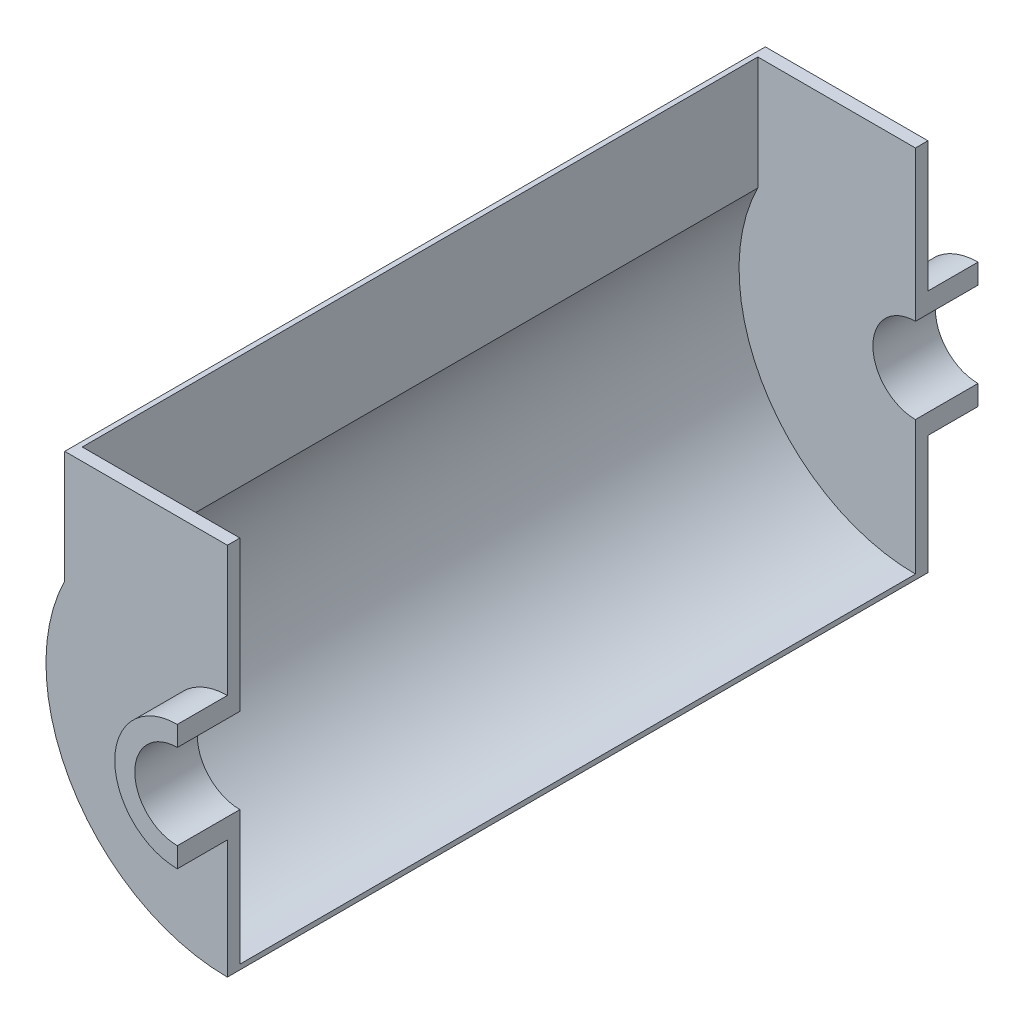
ISO-10303-21;
HEADER;
FILE_DESCRIPTION(('STEP AP214'),'2;1');
FILE_NAME('part.step','',(''),(''),'','','');
FILE_SCHEMA(('AUTOMOTIVE_DESIGN { 1 0 10303 214 1 1 1 1 }'));
ENDSEC;
DATA;
#1=APPLICATION_CONTEXT('core data for automotive mechanical design processes');
#2=APPLICATION_PROTOCOL_DEFINITION('international standard','automotive_design',2000,#1);
#3=PRODUCT_CONTEXT('',#1,'mechanical');
#4=PRODUCT('Part','Part','',(#3));
#5=PRODUCT_RELATED_PRODUCT_CATEGORY('part','',(#4));
#6=PRODUCT_DEFINITION_FORMATION('','',#4);
#7=PRODUCT_DEFINITION_CONTEXT('part definition',#1,'design');
#8=PRODUCT_DEFINITION('design','',#6,#7);
#9=PRODUCT_DEFINITION_SHAPE('','',#8);
#10=(LENGTH_UNIT() NAMED_UNIT(*) SI_UNIT(.MILLI.,.METRE.));
#11=(NAMED_UNIT(*) PLANE_ANGLE_UNIT() SI_UNIT($,.RADIAN.));
#12=(NAMED_UNIT(*) SI_UNIT($,.STERADIAN.) SOLID_ANGLE_UNIT());
#13=UNCERTAINTY_MEASURE_WITH_UNIT(LENGTH_MEASURE(1.E-05),#10,'distance_accuracy_value','');
#14=(GEOMETRIC_REPRESENTATION_CONTEXT(3) GLOBAL_UNCERTAINTY_ASSIGNED_CONTEXT((#13)) GLOBAL_UNIT_ASSIGNED_CONTEXT((#10,
#11,#12)) REPRESENTATION_CONTEXT('',''));
#15=CARTESIAN_POINT('',(0.,0.,0.));
#16=DIRECTION('',(0.,0.,1.));
#17=DIRECTION('',(1.,0.,0.));
#18=AXIS2_PLACEMENT_3D('',#15,#16,#17);
#19=CARTESIAN_POINT('',(0.,0.,-5.));
#20=DIRECTION('',(0.,0.,1.));
#21=DIRECTION('',(1.,0.,0.));
#22=AXIS2_PLACEMENT_3D('',#19,#20,#21);
#23=CYLINDRICAL_SURFACE('',#22,17.);
#24=DIRECTION('',(0.,0.,1.));
#25=VECTOR('',#24,1.);
#26=CARTESIAN_POINT('',(0.,17.,-5.));
#27=LINE('',#26,#25);
#28=CARTESIAN_POINT('',(0.,17.,-5.));
#29=VERTEX_POINT('',#28);
#30=CARTESIAN_POINT('',(0.,17.,20.));
#31=VERTEX_POINT('',#30);
#32=EDGE_CURVE('E40',#29,#31,#27,.T.);
#33=ORIENTED_EDGE('',*,*,#32,.T.);
#34=CARTESIAN_POINT('',(0.,0.,20.));
#35=DIRECTION('',(0.,0.,-1.));
#36=DIRECTION('',(1.,0.,0.));
#37=AXIS2_PLACEMENT_3D('',#34,#35,#36);
#38=CIRCLE('',#37,17.);
#39=CARTESIAN_POINT('',(0.,-17.,20.));
#40=VERTEX_POINT('',#39);
#41=EDGE_CURVE('E230',#40,#31,#38,.T.);
#42=ORIENTED_EDGE('',*,*,#41,.F.);
#43=DIRECTION('',(0.,0.,1.));
#44=VECTOR('',#43,1.);
#45=CARTESIAN_POINT('',(0.,-17.,-5.));
#46=LINE('',#45,#44);
#47=CARTESIAN_POINT('',(0.,-17.,-5.));
#48=VERTEX_POINT('',#47);
#49=EDGE_CURVE('E11',#48,#40,#46,.T.);
#50=ORIENTED_EDGE('',*,*,#49,.F.);
#51=CARTESIAN_POINT('',(0.,0.,-5.));
#52=DIRECTION('',(0.,0.,-1.));
#53=DIRECTION('',(1.,0.,0.));
#54=AXIS2_PLACEMENT_3D('',#51,#52,#53);
#55=CIRCLE('',#54,17.);
#56=EDGE_CURVE('E247',#48,#29,#55,.T.);
#57=ORIENTED_EDGE('',*,*,#56,.T.);
#58=EDGE_LOOP('',(#33,#42,#50,#57));
#59=FACE_BOUND('',#58,.T.);
#60=ADVANCED_FACE('F37',(#59),#23,.F.);
#61=CARTESIAN_POINT('',(0.,-17.,-5.));
#62=DIRECTION('',(1.,0.,0.));
#63=DIRECTION('',(0.,0.,-1.));
#64=AXIS2_PLACEMENT_3D('',#61,#62,#63);
#65=PLANE('',#64);
#66=ORIENTED_EDGE('',*,*,#49,.T.);
#67=DIRECTION('',(0.,1.,0.));
#68=VECTOR('',#67,1.);
#69=CARTESIAN_POINT('',(0.,-17.,20.));
#70=LINE('',#69,#68);
#71=CARTESIAN_POINT('',(0.,-25.,20.));
#72=VERTEX_POINT('',#71);
#73=EDGE_CURVE('E244',#72,#40,#70,.T.);
#74=ORIENTED_EDGE('',*,*,#73,.F.);
#75=DIRECTION('',(0.,0.,1.));
#76=VECTOR('',#75,1.);
#77=CARTESIAN_POINT('',(0.,-25.,-5.));
#78=LINE('',#77,#76);
#79=CARTESIAN_POINT('',(0.,-25.,0.));
#80=VERTEX_POINT('',#79);
#81=EDGE_CURVE('E45',#80,#72,#78,.T.);
#82=ORIENTED_EDGE('',*,*,#81,.F.);
#83=DIRECTION('',(0.,1.,0.));
#84=VECTOR('',#83,1.);
#85=CARTESIAN_POINT('',(0.,-25.,0.));
#86=LINE('',#85,#84);
#87=CARTESIAN_POINT('',(0.,-72.5,0.));
#88=VERTEX_POINT('',#87);
#89=EDGE_CURVE('E212',#88,#80,#86,.T.);
#90=ORIENTED_EDGE('',*,*,#89,.F.);
#91=DIRECTION('',(0.,0.,1.));
#92=VECTOR('',#91,1.);
#93=CARTESIAN_POINT('',(0.,-72.5,-5.));
#94=LINE('',#93,#92);
#95=CARTESIAN_POINT('',(0.,-72.5,-280.));
#96=VERTEX_POINT('',#95);
#97=EDGE_CURVE('E228',#96,#88,#94,.T.);
#98=ORIENTED_EDGE('',*,*,#97,.F.);
#99=DIRECTION('',(0.,1.,0.));
#100=VECTOR('',#99,1.);
#101=CARTESIAN_POINT('',(0.,-25.,-280.));
#102=LINE('',#101,#100);
#103=CARTESIAN_POINT('',(0.,-25.,-280.));
#104=VERTEX_POINT('',#103);
#105=EDGE_CURVE('E161',#96,#104,#102,.T.);
#106=ORIENTED_EDGE('',*,*,#105,.T.);
#107=DIRECTION('',(0.,0.,-1.));
#108=VECTOR('',#107,1.);
#109=CARTESIAN_POINT('',(0.,-25.,-275.));
#110=LINE('',#109,#108);
#111=CARTESIAN_POINT('',(0.,-25.,-300.));
#112=VERTEX_POINT('',#111);
#113=EDGE_CURVE('E188',#104,#112,#110,.T.);
#114=ORIENTED_EDGE('',*,*,#113,.T.);
#115=DIRECTION('',(0.,1.,0.));
#116=VECTOR('',#115,1.);
#117=CARTESIAN_POINT('',(0.,-17.,-300.));
#118=LINE('',#117,#116);
#119=CARTESIAN_POINT('',(0.,-17.,-300.));
#120=VERTEX_POINT('',#119);
#121=EDGE_CURVE('E180',#112,#120,#118,.T.);
#122=ORIENTED_EDGE('',*,*,#121,.T.);
#123=DIRECTION('',(0.,0.,-1.));
#124=VECTOR('',#123,1.);
#125=CARTESIAN_POINT('',(0.,-17.,-275.));
#126=LINE('',#125,#124);
#127=CARTESIAN_POINT('',(0.,-17.,-275.));
#128=VERTEX_POINT('',#127);
#129=EDGE_CURVE('E184',#128,#120,#126,.T.);
#130=ORIENTED_EDGE('',*,*,#129,.F.);
#131=DIRECTION('',(0.,1.,0.));
#132=VECTOR('',#131,1.);
#133=CARTESIAN_POINT('',(0.,-17.,-275.));
#134=LINE('',#133,#132);
#135=CARTESIAN_POINT('',(0.,-70.5,-275.));
#136=VERTEX_POINT('',#135);
#137=EDGE_CURVE('E176',#136,#128,#134,.T.);
#138=ORIENTED_EDGE('',*,*,#137,.F.);
#139=DIRECTION('',(0.,0.,1.));
#140=VECTOR('',#139,1.);
#141=CARTESIAN_POINT('',(0.,-70.5,-300.002));
#142=LINE('',#141,#140);
#143=CARTESIAN_POINT('',(0.,-70.5,-5.));
#144=VERTEX_POINT('',#143);
#145=EDGE_CURVE('E202',#136,#144,#142,.T.);
#146=ORIENTED_EDGE('',*,*,#145,.T.);
#147=DIRECTION('',(0.,1.,0.));
#148=VECTOR('',#147,1.);
#149=CARTESIAN_POINT('',(0.,-17.,-5.));
#150=LINE('',#149,#148);
#151=EDGE_CURVE('E252',#144,#48,#150,.T.);
#152=ORIENTED_EDGE('',*,*,#151,.T.);
#153=EDGE_LOOP('',(#66,#74,#82,#90,#98,#106,#114,#122,#130,#138,#146,#152));
#154=FACE_BOUND('',#153,.T.);
#155=ADVANCED_FACE('F269',(#154),#65,.T.);
#156=CARTESIAN_POINT('',(0.,0.,-5.));
#157=DIRECTION('',(0.,0.,1.));
#158=DIRECTION('',(1.,0.,0.));
#159=AXIS2_PLACEMENT_3D('',#156,#157,#158);
#160=CYLINDRICAL_SURFACE('',#159,25.);
#161=CARTESIAN_POINT('',(0.,0.,0.));
#162=DIRECTION('',(0.,0.,-1.));
#163=DIRECTION('',(1.,0.,0.));
#164=AXIS2_PLACEMENT_3D('',#161,#162,#163);
#165=CIRCLE('',#164,25.);
#166=CARTESIAN_POINT('',(0.,25.,0.));
#167=VERTEX_POINT('',#166);
#168=EDGE_CURVE('E61',#80,#167,#165,.T.);
#169=ORIENTED_EDGE('',*,*,#168,.F.);
#170=ORIENTED_EDGE('',*,*,#81,.T.);
#171=CARTESIAN_POINT('',(0.,0.,20.));
#172=DIRECTION('',(0.,0.,1.));
#173=DIRECTION('',(1.,0.,0.));
#174=AXIS2_PLACEMENT_3D('',#171,#172,#173);
#175=CIRCLE('',#174,25.);
#176=CARTESIAN_POINT('',(0.,25.,20.));
#177=VERTEX_POINT('',#176);
#178=EDGE_CURVE('E241',#177,#72,#175,.T.);
#179=ORIENTED_EDGE('',*,*,#178,.F.);
#180=DIRECTION('',(0.,0.,1.));
#181=VECTOR('',#180,1.);
#182=CARTESIAN_POINT('',(0.,25.,-5.));
#183=LINE('',#182,#181);
#184=EDGE_CURVE('E254',#167,#177,#183,.T.);
#185=ORIENTED_EDGE('',*,*,#184,.F.);
#186=EDGE_LOOP('',(#169,#170,#179,#185));
#187=FACE_BOUND('',#186,.T.);
#188=ADVANCED_FACE('F333',(#187),#160,.T.);
#189=CARTESIAN_POINT('',(0.,25.,-5.));
#190=DIRECTION('',(1.,0.,0.));
#191=DIRECTION('',(0.,0.,-1.));
#192=AXIS2_PLACEMENT_3D('',#189,#190,#191);
#193=PLANE('',#192);
#194=DIRECTION('',(0.,1.,0.));
#195=VECTOR('',#194,1.);
#196=CARTESIAN_POINT('',(0.,25.,-5.));
#197=LINE('',#196,#195);
#198=CARTESIAN_POINT('',(0.,77.,-5.));
#199=VERTEX_POINT('',#198);
#200=EDGE_CURVE('E250',#29,#199,#197,.T.);
#201=ORIENTED_EDGE('',*,*,#200,.T.);
#202=DIRECTION('',(0.,0.,1.));
#203=VECTOR('',#202,1.);
#204=CARTESIAN_POINT('',(0.,77.,-5.));
#205=LINE('',#204,#203);
#206=CARTESIAN_POINT('',(0.,77.,0.));
#207=VERTEX_POINT('',#206);
#208=EDGE_CURVE('E211',#199,#207,#205,.T.);
#209=ORIENTED_EDGE('',*,*,#208,.T.);
#210=DIRECTION('',(0.,1.,0.));
#211=VECTOR('',#210,1.);
#212=CARTESIAN_POINT('',(0.,25.,0.));
#213=LINE('',#212,#211);
#214=EDGE_CURVE('E214',#167,#207,#213,.T.);
#215=ORIENTED_EDGE('',*,*,#214,.F.);
#216=ORIENTED_EDGE('',*,*,#184,.T.);
#217=DIRECTION('',(0.,1.,0.));
#218=VECTOR('',#217,1.);
#219=CARTESIAN_POINT('',(0.,25.,20.));
#220=LINE('',#219,#218);
#221=EDGE_CURVE('E238',#31,#177,#220,.T.);
#222=ORIENTED_EDGE('',*,*,#221,.F.);
#223=ORIENTED_EDGE('',*,*,#32,.F.);
#224=EDGE_LOOP('',(#201,#209,#215,#216,#222,#223));
#225=FACE_BOUND('',#224,.T.);
#226=ADVANCED_FACE('F263',(#225),#193,.T.);
#227=CARTESIAN_POINT('',(0.,0.,-5.));
#228=DIRECTION('',(0.,0.,1.));
#229=DIRECTION('',(1.,0.,0.));
#230=AXIS2_PLACEMENT_3D('',#227,#228,#229);
#231=PLANE('',#230);
#232=ORIENTED_EDGE('',*,*,#151,.F.);
#233=CARTESIAN_POINT('',(0.,0.,-5.));
#234=DIRECTION('',(0.,0.,-1.));
#235=DIRECTION('',(-1.,0.,0.));
#236=AXIS2_PLACEMENT_3D('',#233,#234,#235);
#237=CIRCLE('',#236,70.5);
#238=CARTESIAN_POINT('',(-63.,31.6425346645935,-5.));
#239=VERTEX_POINT('',#238);
#240=EDGE_CURVE('E187',#144,#239,#237,.T.);
#241=ORIENTED_EDGE('',*,*,#240,.T.);
#242=DIRECTION('',(0.,1.,0.));
#243=VECTOR('',#242,1.);
#244=CARTESIAN_POINT('',(-63.,31.6425346645935,-5.));
#245=LINE('',#244,#243);
#246=CARTESIAN_POINT('',(-63.,77.,-5.));
#247=VERTEX_POINT('',#246);
#248=EDGE_CURVE('E197',#239,#247,#245,.T.);
#249=ORIENTED_EDGE('',*,*,#248,.T.);
#250=DIRECTION('',(-1.,0.,0.));
#251=VECTOR('',#250,1.);
#252=CARTESIAN_POINT('',(0.,77.,-5.));
#253=LINE('',#252,#251);
#254=EDGE_CURVE('E209',#199,#247,#253,.T.);
#255=ORIENTED_EDGE('',*,*,#254,.F.);
#256=ORIENTED_EDGE('',*,*,#200,.F.);
#257=ORIENTED_EDGE('',*,*,#56,.F.);
#258=EDGE_LOOP('',(#232,#241,#249,#255,#256,#257));
#259=FACE_BOUND('',#258,.T.);
#260=ADVANCED_FACE('F273',(#259),#231,.F.);
#261=CARTESIAN_POINT('',(0.,0.,20.));
#262=DIRECTION('',(0.,0.,1.));
#263=DIRECTION('',(1.,0.,0.));
#264=AXIS2_PLACEMENT_3D('',#261,#262,#263);
#265=PLANE('',#264);
#266=ORIENTED_EDGE('',*,*,#41,.T.);
#267=ORIENTED_EDGE('',*,*,#221,.T.);
#268=ORIENTED_EDGE('',*,*,#178,.T.);
#269=ORIENTED_EDGE('',*,*,#73,.T.);
#270=EDGE_LOOP('',(#266,#267,#268,#269));
#271=FACE_BOUND('',#270,.T.);
#272=ADVANCED_FACE('F266',(#271),#265,.T.);
#273=CARTESIAN_POINT('',(0.,0.,-5.));
#274=DIRECTION('',(0.,0.,1.));
#275=DIRECTION('',(1.,0.,0.));
#276=AXIS2_PLACEMENT_3D('',#273,#274,#275);
#277=CYLINDRICAL_SURFACE('',#276,72.5);
#278=CARTESIAN_POINT('',(0.,0.,0.));
#279=DIRECTION('',(0.,0.,1.));
#280=DIRECTION('',(1.,0.,0.));
#281=AXIS2_PLACEMENT_3D('',#278,#279,#280);
#282=CIRCLE('',#281,72.5);
#283=CARTESIAN_POINT('',(-65.,32.1130814466629,0.));
#284=VERTEX_POINT('',#283);
#285=EDGE_CURVE('E223',#284,#88,#282,.T.);
#286=ORIENTED_EDGE('',*,*,#285,.F.);
#287=DIRECTION('',(0.,0.,1.));
#288=VECTOR('',#287,1.);
#289=CARTESIAN_POINT('',(-65.,32.1130814466629,-5.));
#290=LINE('',#289,#288);
#291=CARTESIAN_POINT('',(-65.,32.1130814466629,-280.));
#292=VERTEX_POINT('',#291);
#293=EDGE_CURVE('E231',#292,#284,#290,.T.);
#294=ORIENTED_EDGE('',*,*,#293,.F.);
#295=CARTESIAN_POINT('',(0.,0.,-280.));
#296=DIRECTION('',(0.,0.,1.));
#297=DIRECTION('',(1.,0.,0.));
#298=AXIS2_PLACEMENT_3D('',#295,#296,#297);
#299=CIRCLE('',#298,72.5);
#300=EDGE_CURVE('E285',#292,#96,#299,.T.);
#301=ORIENTED_EDGE('',*,*,#300,.T.);
#302=ORIENTED_EDGE('',*,*,#97,.T.);
#303=EDGE_LOOP('',(#286,#294,#301,#302));
#304=FACE_BOUND('',#303,.T.);
#305=ADVANCED_FACE('F286',(#304),#277,.T.);
#306=CARTESIAN_POINT('',(-65.,77.,-5.));
#307=DIRECTION('',(-1.,0.,0.));
#308=DIRECTION('',(0.,-1.,0.));
#309=AXIS2_PLACEMENT_3D('',#306,#307,#308);
#310=PLANE('',#309);
#311=DIRECTION('',(0.,-1.,0.));
#312=VECTOR('',#311,1.);
#313=CARTESIAN_POINT('',(-65.,77.,0.));
#314=LINE('',#313,#312);
#315=CARTESIAN_POINT('',(-65.,77.,0.));
#316=VERTEX_POINT('',#315);
#317=EDGE_CURVE('E220',#316,#284,#314,.T.);
#318=ORIENTED_EDGE('',*,*,#317,.F.);
#319=DIRECTION('',(0.,0.,1.));
#320=VECTOR('',#319,1.);
#321=CARTESIAN_POINT('',(-65.,77.,-5.));
#322=LINE('',#321,#320);
#323=CARTESIAN_POINT('',(-65.,77.,-280.));
#324=VERTEX_POINT('',#323);
#325=EDGE_CURVE('E233',#324,#316,#322,.T.);
#326=ORIENTED_EDGE('',*,*,#325,.F.);
#327=DIRECTION('',(0.,-1.,0.));
#328=VECTOR('',#327,1.);
#329=CARTESIAN_POINT('',(-65.,77.,-280.));
#330=LINE('',#329,#328);
#331=EDGE_CURVE('E290',#324,#292,#330,.T.);
#332=ORIENTED_EDGE('',*,*,#331,.T.);
#333=ORIENTED_EDGE('',*,*,#293,.T.);
#334=EDGE_LOOP('',(#318,#326,#332,#333));
#335=FACE_BOUND('',#334,.T.);
#336=ADVANCED_FACE('F320',(#335),#310,.T.);
#337=CARTESIAN_POINT('',(0.,77.,-5.));
#338=DIRECTION('',(0.,1.,0.));
#339=DIRECTION('',(0.,0.,1.));
#340=AXIS2_PLACEMENT_3D('',#337,#338,#339);
#341=PLANE('',#340);
#342=DIRECTION('',(-1.,0.,0.));
#343=VECTOR('',#342,1.);
#344=CARTESIAN_POINT('',(0.,77.,0.));
#345=LINE('',#344,#343);
#346=EDGE_CURVE('E217',#207,#316,#345,.T.);
#347=ORIENTED_EDGE('',*,*,#346,.F.);
#348=ORIENTED_EDGE('',*,*,#208,.F.);
#349=ORIENTED_EDGE('',*,*,#254,.T.);
#350=DIRECTION('',(0.,0.,1.));
#351=VECTOR('',#350,1.);
#352=CARTESIAN_POINT('',(-63.,77.,-300.002));
#353=LINE('',#352,#351);
#354=CARTESIAN_POINT('',(-63.,77.,-275.));
#355=VERTEX_POINT('',#354);
#356=EDGE_CURVE('E53',#355,#247,#353,.T.);
#357=ORIENTED_EDGE('',*,*,#356,.F.);
#358=DIRECTION('',(-1.,0.,0.));
#359=VECTOR('',#358,1.);
#360=CARTESIAN_POINT('',(0.,77.,-275.));
#361=LINE('',#360,#359);
#362=CARTESIAN_POINT('',(0.,77.,-275.));
#363=VERTEX_POINT('',#362);
#364=EDGE_CURVE('E151',#363,#355,#361,.T.);
#365=ORIENTED_EDGE('',*,*,#364,.F.);
#366=DIRECTION('',(0.,0.,-1.));
#367=VECTOR('',#366,1.);
#368=CARTESIAN_POINT('',(0.,77.,-275.));
#369=LINE('',#368,#367);
#370=CARTESIAN_POINT('',(0.,77.,-280.));
#371=VERTEX_POINT('',#370);
#372=EDGE_CURVE('E156',#363,#371,#369,.T.);
#373=ORIENTED_EDGE('',*,*,#372,.T.);
#374=DIRECTION('',(-1.,0.,0.));
#375=VECTOR('',#374,1.);
#376=CARTESIAN_POINT('',(0.,77.,-280.));
#377=LINE('',#376,#375);
#378=EDGE_CURVE('E316',#371,#324,#377,.T.);
#379=ORIENTED_EDGE('',*,*,#378,.T.);
#380=ORIENTED_EDGE('',*,*,#325,.T.);
#381=EDGE_LOOP('',(#347,#348,#349,#357,#365,#373,#379,#380));
#382=FACE_BOUND('',#381,.T.);
#383=ADVANCED_FACE('F154',(#382),#341,.T.);
#384=CARTESIAN_POINT('',(0.,0.,0.));
#385=DIRECTION('',(0.,0.,1.));
#386=DIRECTION('',(1.,0.,0.));
#387=AXIS2_PLACEMENT_3D('',#384,#385,#386);
#388=PLANE('',#387);
#389=ORIENTED_EDGE('',*,*,#168,.T.);
#390=ORIENTED_EDGE('',*,*,#214,.T.);
#391=ORIENTED_EDGE('',*,*,#346,.T.);
#392=ORIENTED_EDGE('',*,*,#317,.T.);
#393=ORIENTED_EDGE('',*,*,#285,.T.);
#394=ORIENTED_EDGE('',*,*,#89,.T.);
#395=EDGE_LOOP('',(#389,#390,#391,#392,#393,#394));
#396=FACE_BOUND('',#395,.T.);
#397=ADVANCED_FACE('F278',(#396),#388,.T.);
#398=CARTESIAN_POINT('',(0.,0.,-300.002));
#399=DIRECTION('',(0.,0.,1.));
#400=DIRECTION('',(1.,0.,0.));
#401=AXIS2_PLACEMENT_3D('',#398,#399,#400);
#402=CYLINDRICAL_SURFACE('',#401,70.5);
#403=ORIENTED_EDGE('',*,*,#145,.F.);
#404=CARTESIAN_POINT('',(0.,0.,-275.));
#405=DIRECTION('',(0.,0.,-1.));
#406=DIRECTION('',(-1.,0.,0.));
#407=AXIS2_PLACEMENT_3D('',#404,#405,#406);
#408=CIRCLE('',#407,70.5);
#409=CARTESIAN_POINT('',(-63.,31.6425346645935,-275.));
#410=VERTEX_POINT('',#409);
#411=EDGE_CURVE('E206',#136,#410,#408,.T.);
#412=ORIENTED_EDGE('',*,*,#411,.T.);
#413=DIRECTION('',(0.,0.,1.));
#414=VECTOR('',#413,1.);
#415=CARTESIAN_POINT('',(-63.,31.6425346645935,-300.002));
#416=LINE('',#415,#414);
#417=EDGE_CURVE('E200',#410,#239,#416,.T.);
#418=ORIENTED_EDGE('',*,*,#417,.T.);
#419=ORIENTED_EDGE('',*,*,#240,.F.);
#420=EDGE_LOOP('',(#403,#412,#418,#419));
#421=FACE_BOUND('',#420,.T.);
#422=ADVANCED_FACE('F378',(#421),#402,.F.);
#423=CARTESIAN_POINT('',(-63.,31.6425346645935,-300.002));
#424=DIRECTION('',(1.,0.,0.));
#425=DIRECTION('',(0.,0.,-1.));
#426=AXIS2_PLACEMENT_3D('',#423,#424,#425);
#427=PLANE('',#426);
#428=ORIENTED_EDGE('',*,*,#417,.F.);
#429=DIRECTION('',(0.,1.,0.));
#430=VECTOR('',#429,1.);
#431=CARTESIAN_POINT('',(-63.,31.6425346645935,-275.));
#432=LINE('',#431,#430);
#433=EDGE_CURVE('E204',#410,#355,#432,.T.);
#434=ORIENTED_EDGE('',*,*,#433,.T.);
#435=ORIENTED_EDGE('',*,*,#356,.T.);
#436=ORIENTED_EDGE('',*,*,#248,.F.);
#437=EDGE_LOOP('',(#428,#434,#435,#436));
#438=FACE_BOUND('',#437,.T.);
#439=ADVANCED_FACE('F382',(#438),#427,.T.);
#440=CARTESIAN_POINT('',(0.,0.,-275.));
#441=DIRECTION('',(0.,0.,-1.));
#442=DIRECTION('',(1.,0.,0.));
#443=AXIS2_PLACEMENT_3D('',#440,#441,#442);
#444=PLANE('',#443);
#445=ORIENTED_EDGE('',*,*,#433,.F.);
#446=ORIENTED_EDGE('',*,*,#411,.F.);
#447=ORIENTED_EDGE('',*,*,#137,.T.);
#448=CARTESIAN_POINT('',(0.,0.,-275.));
#449=DIRECTION('',(0.,0.,-1.));
#450=DIRECTION('',(1.,0.,0.));
#451=AXIS2_PLACEMENT_3D('',#448,#449,#450);
#452=CIRCLE('',#451,17.);
#453=CARTESIAN_POINT('',(0.,17.,-275.));
#454=VERTEX_POINT('',#453);
#455=EDGE_CURVE('E174',#128,#454,#452,.T.);
#456=ORIENTED_EDGE('',*,*,#455,.T.);
#457=DIRECTION('',(0.,1.,0.));
#458=VECTOR('',#457,1.);
#459=CARTESIAN_POINT('',(0.,25.,-275.));
#460=LINE('',#459,#458);
#461=EDGE_CURVE('E166',#454,#363,#460,.T.);
#462=ORIENTED_EDGE('',*,*,#461,.T.);
#463=ORIENTED_EDGE('',*,*,#364,.T.);
#464=EDGE_LOOP('',(#445,#446,#447,#456,#462,#463));
#465=FACE_BOUND('',#464,.T.);
#466=ADVANCED_FACE('F172',(#465),#444,.F.);
#467=CARTESIAN_POINT('',(0.,0.,-275.));
#468=DIRECTION('',(0.,0.,-1.));
#469=DIRECTION('',(1.,0.,0.));
#470=AXIS2_PLACEMENT_3D('',#467,#468,#469);
#471=CYLINDRICAL_SURFACE('',#470,17.);
#472=DIRECTION('',(0.,0.,-1.));
#473=VECTOR('',#472,1.);
#474=CARTESIAN_POINT('',(0.,17.,-275.));
#475=LINE('',#474,#473);
#476=CARTESIAN_POINT('',(0.,17.,-300.));
#477=VERTEX_POINT('',#476);
#478=EDGE_CURVE('E178',#454,#477,#475,.T.);
#479=ORIENTED_EDGE('',*,*,#478,.F.);
#480=ORIENTED_EDGE('',*,*,#455,.F.);
#481=ORIENTED_EDGE('',*,*,#129,.T.);
#482=CARTESIAN_POINT('',(0.,0.,-300.));
#483=DIRECTION('',(0.,0.,-1.));
#484=DIRECTION('',(1.,0.,0.));
#485=AXIS2_PLACEMENT_3D('',#482,#483,#484);
#486=CIRCLE('',#485,17.);
#487=EDGE_CURVE('E170',#120,#477,#486,.T.);
#488=ORIENTED_EDGE('',*,*,#487,.T.);
#489=EDGE_LOOP('',(#479,#480,#481,#488));
#490=FACE_BOUND('',#489,.T.);
#491=ADVANCED_FACE('F312',(#490),#471,.F.);
#492=CARTESIAN_POINT('',(0.,0.,-275.));
#493=DIRECTION('',(0.,0.,-1.));
#494=DIRECTION('',(1.,0.,0.));
#495=AXIS2_PLACEMENT_3D('',#492,#493,#494);
#496=CYLINDRICAL_SURFACE('',#495,25.);
#497=CARTESIAN_POINT('',(0.,0.,-280.));
#498=DIRECTION('',(0.,0.,-1.));
#499=DIRECTION('',(1.,0.,0.));
#500=AXIS2_PLACEMENT_3D('',#497,#498,#499);
#501=CIRCLE('',#500,25.);
#502=CARTESIAN_POINT('',(0.,25.,-280.));
#503=VERTEX_POINT('',#502);
#504=EDGE_CURVE('E294',#104,#503,#501,.T.);
#505=ORIENTED_EDGE('',*,*,#504,.T.);
#506=DIRECTION('',(0.,0.,-1.));
#507=VECTOR('',#506,1.);
#508=CARTESIAN_POINT('',(0.,25.,-275.));
#509=LINE('',#508,#507);
#510=CARTESIAN_POINT('',(0.,25.,-300.));
#511=VERTEX_POINT('',#510);
#512=EDGE_CURVE('E191',#503,#511,#509,.T.);
#513=ORIENTED_EDGE('',*,*,#512,.T.);
#514=CARTESIAN_POINT('',(0.,0.,-300.));
#515=DIRECTION('',(0.,0.,1.));
#516=DIRECTION('',(1.,0.,0.));
#517=AXIS2_PLACEMENT_3D('',#514,#515,#516);
#518=CIRCLE('',#517,25.);
#519=EDGE_CURVE('E303',#511,#112,#518,.T.);
#520=ORIENTED_EDGE('',*,*,#519,.T.);
#521=ORIENTED_EDGE('',*,*,#113,.F.);
#522=EDGE_LOOP('',(#505,#513,#520,#521));
#523=FACE_BOUND('',#522,.T.);
#524=ADVANCED_FACE('F314',(#523),#496,.T.);
#525=CARTESIAN_POINT('',(0.,25.,-275.));
#526=DIRECTION('',(1.,0.,0.));
#527=DIRECTION('',(0.,0.,1.));
#528=AXIS2_PLACEMENT_3D('',#525,#526,#527);
#529=PLANE('',#528);
#530=ORIENTED_EDGE('',*,*,#461,.F.);
#531=ORIENTED_EDGE('',*,*,#478,.T.);
#532=DIRECTION('',(0.,1.,0.));
#533=VECTOR('',#532,1.);
#534=CARTESIAN_POINT('',(0.,25.,-300.));
#535=LINE('',#534,#533);
#536=EDGE_CURVE('E301',#477,#511,#535,.T.);
#537=ORIENTED_EDGE('',*,*,#536,.T.);
#538=ORIENTED_EDGE('',*,*,#512,.F.);
#539=DIRECTION('',(0.,1.,0.));
#540=VECTOR('',#539,1.);
#541=CARTESIAN_POINT('',(0.,25.,-280.));
#542=LINE('',#541,#540);
#543=EDGE_CURVE('E169',#503,#371,#542,.T.);
#544=ORIENTED_EDGE('',*,*,#543,.T.);
#545=ORIENTED_EDGE('',*,*,#372,.F.);
#546=EDGE_LOOP('',(#530,#531,#537,#538,#544,#545));
#547=FACE_BOUND('',#546,.T.);
#548=ADVANCED_FACE('F164',(#547),#529,.T.);
#549=CARTESIAN_POINT('',(0.,0.,-300.));
#550=DIRECTION('',(0.,0.,-1.));
#551=DIRECTION('',(1.,0.,0.));
#552=AXIS2_PLACEMENT_3D('',#549,#550,#551);
#553=PLANE('',#552);
#554=ORIENTED_EDGE('',*,*,#487,.F.);
#555=ORIENTED_EDGE('',*,*,#121,.F.);
#556=ORIENTED_EDGE('',*,*,#519,.F.);
#557=ORIENTED_EDGE('',*,*,#536,.F.);
#558=EDGE_LOOP('',(#554,#555,#556,#557));
#559=FACE_BOUND('',#558,.T.);
#560=ADVANCED_FACE('F310',(#559),#553,.T.);
#561=CARTESIAN_POINT('',(0.,0.,-280.));
#562=DIRECTION('',(0.,0.,-1.));
#563=DIRECTION('',(1.,0.,0.));
#564=AXIS2_PLACEMENT_3D('',#561,#562,#563);
#565=PLANE('',#564);
#566=ORIENTED_EDGE('',*,*,#504,.F.);
#567=ORIENTED_EDGE('',*,*,#105,.F.);
#568=ORIENTED_EDGE('',*,*,#300,.F.);
#569=ORIENTED_EDGE('',*,*,#331,.F.);
#570=ORIENTED_EDGE('',*,*,#378,.F.);
#571=ORIENTED_EDGE('',*,*,#543,.F.);
#572=EDGE_LOOP('',(#566,#567,#568,#569,#570,#571));
#573=FACE_BOUND('',#572,.T.);
#574=ADVANCED_FACE('F292',(#573),#565,.T.);
#575=CLOSED_SHELL('',(#60,#155,#188,#226,#260,#272,#305,#336,#383,#397,#422,#439,#466,#491,#524,
#548,#560,#574));
#576=MANIFOLD_SOLID_BREP('B2',#575);
#577=ADVANCED_BREP_SHAPE_REPRESENTATION('',(#18,#576),#14);
#578=SHAPE_DEFINITION_REPRESENTATION(#9,#577);
ENDSEC;
END-ISO-10303-21;
